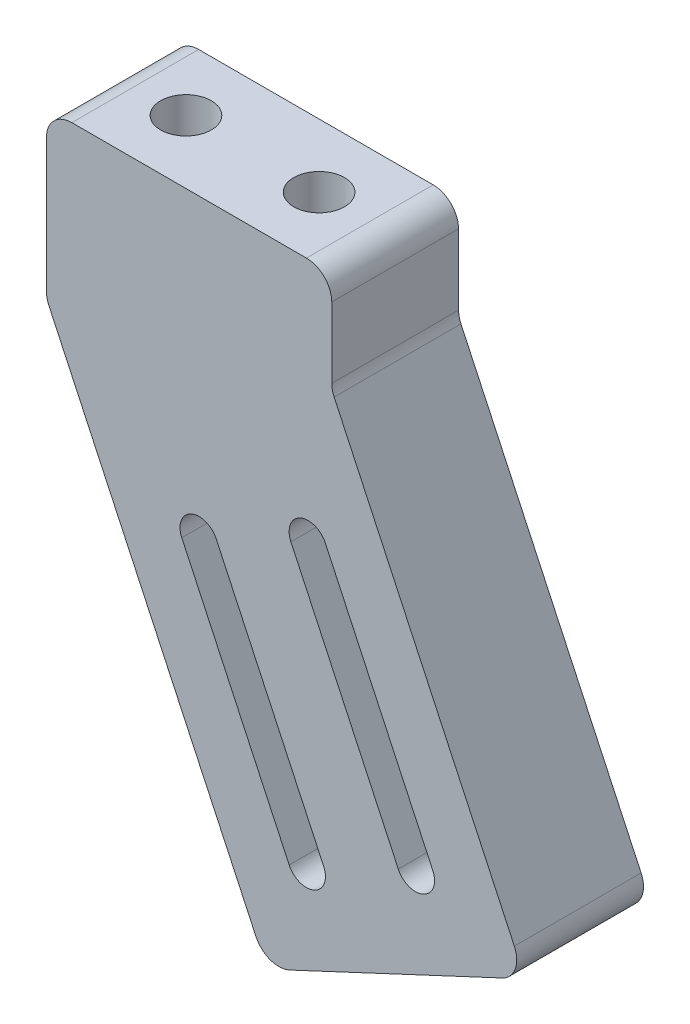
ISO-10303-21;
HEADER;
FILE_DESCRIPTION(('STEP AP214'),'2;1');
FILE_NAME('part.step','',(''),(''),'','','');
FILE_SCHEMA(('AUTOMOTIVE_DESIGN { 1 0 10303 214 1 1 1 1 }'));
ENDSEC;
DATA;
#1=APPLICATION_CONTEXT('core data for automotive mechanical design processes');
#2=APPLICATION_PROTOCOL_DEFINITION('international standard','automotive_design',2000,#1);
#3=PRODUCT_CONTEXT('',#1,'mechanical');
#4=PRODUCT('Part','Part','',(#3));
#5=PRODUCT_RELATED_PRODUCT_CATEGORY('part','',(#4));
#6=PRODUCT_DEFINITION_FORMATION('','',#4);
#7=PRODUCT_DEFINITION_CONTEXT('part definition',#1,'design');
#8=PRODUCT_DEFINITION('design','',#6,#7);
#9=PRODUCT_DEFINITION_SHAPE('','',#8);
#10=(LENGTH_UNIT() NAMED_UNIT(*) SI_UNIT(.MILLI.,.METRE.));
#11=(NAMED_UNIT(*) PLANE_ANGLE_UNIT() SI_UNIT($,.RADIAN.));
#12=(NAMED_UNIT(*) SI_UNIT($,.STERADIAN.) SOLID_ANGLE_UNIT());
#13=UNCERTAINTY_MEASURE_WITH_UNIT(LENGTH_MEASURE(1.E-05),#10,'distance_accuracy_value','');
#14=(GEOMETRIC_REPRESENTATION_CONTEXT(3) GLOBAL_UNCERTAINTY_ASSIGNED_CONTEXT((#13)) GLOBAL_UNIT_ASSIGNED_CONTEXT((#10,
#11,#12)) REPRESENTATION_CONTEXT('',''));
#15=CARTESIAN_POINT('',(0.,0.,0.));
#16=DIRECTION('',(0.,0.,1.));
#17=DIRECTION('',(1.,0.,0.));
#18=AXIS2_PLACEMENT_3D('',#15,#16,#17);
#19=CARTESIAN_POINT('',(0.,0.,0.));
#20=DIRECTION('',(0.,0.,-1.));
#21=DIRECTION('',(-1.,0.,0.));
#22=AXIS2_PLACEMENT_3D('',#19,#20,#21);
#23=PLANE('',#22);
#24=DIRECTION('',(0.,-1.,0.));
#25=VECTOR('',#24,1.);
#26=CARTESIAN_POINT('',(0.,-13.,0.));
#27=LINE('',#26,#25);
#28=CARTESIAN_POINT('',(0.,-2.,0.));
#29=VERTEX_POINT('',#28);
#30=CARTESIAN_POINT('',(0.,-12.5555555555556,0.));
#31=VERTEX_POINT('',#30);
#32=EDGE_CURVE('E366',#29,#31,#27,.T.);
#33=ORIENTED_EDGE('',*,*,#32,.F.);
#34=CARTESIAN_POINT('',(2.,-2.,0.));
#35=DIRECTION('',(0.,0.,-1.));
#36=DIRECTION('',(-1.,0.,0.));
#37=AXIS2_PLACEMENT_3D('',#34,#35,#36);
#38=CIRCLE('',#37,2.);
#39=CARTESIAN_POINT('',(2.,0.,0.));
#40=VERTEX_POINT('',#39);
#41=EDGE_CURVE('E418',#29,#40,#38,.T.);
#42=ORIENTED_EDGE('',*,*,#41,.T.);
#43=DIRECTION('',(-1.,0.,0.));
#44=VECTOR('',#43,1.);
#45=CARTESIAN_POINT('',(0.,0.,0.));
#46=LINE('',#45,#44);
#47=CARTESIAN_POINT('',(20.5,0.,0.));
#48=VERTEX_POINT('',#47);
#49=EDGE_CURVE('E371',#48,#40,#46,.T.);
#50=ORIENTED_EDGE('',*,*,#49,.F.);
#51=CARTESIAN_POINT('',(20.5,-2.,0.));
#52=DIRECTION('',(0.,0.,-1.));
#53=DIRECTION('',(-1.,0.,0.));
#54=AXIS2_PLACEMENT_3D('',#51,#52,#53);
#55=CIRCLE('',#54,2.);
#56=CARTESIAN_POINT('',(22.5,-2.,0.));
#57=VERTEX_POINT('',#56);
#58=EDGE_CURVE('E410',#48,#57,#55,.T.);
#59=ORIENTED_EDGE('',*,*,#58,.T.);
#60=DIRECTION('',(0.,1.,0.));
#61=VECTOR('',#60,1.);
#62=CARTESIAN_POINT('',(22.5,0.,0.));
#63=LINE('',#62,#61);
#64=CARTESIAN_POINT('',(22.5,-7.55555555555555,0.));
#65=VERTEX_POINT('',#64);
#66=EDGE_CURVE('E396',#65,#57,#63,.T.);
#67=ORIENTED_EDGE('',*,*,#66,.F.);
#68=CARTESIAN_POINT('',(24.5,-7.55555555555555,0.));
#69=DIRECTION('',(0.,0.,-1.));
#70=DIRECTION('',(-1.,0.,0.));
#71=AXIS2_PLACEMENT_3D('',#68,#69,#70);
#72=CIRCLE('',#71,2.);
#73=CARTESIAN_POINT('',(22.6882352941176,-8.40261437908496,0.));
#74=VERTEX_POINT('',#73);
#75=EDGE_CURVE('E42',#65,#74,#72,.F.);
#76=ORIENTED_EDGE('',*,*,#75,.T.);
#77=DIRECTION('',(-0.423529411764706,0.905882352941176,0.));
#78=VECTOR('',#77,1.);
#79=CARTESIAN_POINT('',(22.5,-8.,0.));
#80=LINE('',#79,#78);
#81=CARTESIAN_POINT('',(36.9,-38.8,0.));
#82=VERTEX_POINT('',#81);
#83=EDGE_CURVE('E393',#82,#74,#80,.T.);
#84=ORIENTED_EDGE('',*,*,#83,.F.);
#85=CARTESIAN_POINT('',(35.0882352941177,-39.6470588235294,0.));
#86=DIRECTION('',(0.,0.,-1.));
#87=DIRECTION('',(-1.,0.,0.));
#88=AXIS2_PLACEMENT_3D('',#85,#86,#87);
#89=CIRCLE('',#88,2.);
#90=CARTESIAN_POINT('',(35.9352941176471,-41.4588235294118,0.));
#91=VERTEX_POINT('',#90);
#92=EDGE_CURVE('E412',#82,#91,#89,.T.);
#93=ORIENTED_EDGE('',*,*,#92,.T.);
#94=DIRECTION('',(0.905882352941176,0.423529411764706,0.));
#95=VECTOR('',#94,1.);
#96=CARTESIAN_POINT('',(37.7470588235294,-40.6117647058824,0.));
#97=LINE('',#96,#95);
#98=CARTESIAN_POINT('',(19.1764705882353,-49.2941176470588,0.));
#99=VERTEX_POINT('',#98);
#100=EDGE_CURVE('E390',#99,#91,#97,.T.);
#101=ORIENTED_EDGE('',*,*,#100,.F.);
#102=CARTESIAN_POINT('',(18.3294117647059,-47.4823529411765,0.));
#103=DIRECTION('',(0.,0.,-1.));
#104=DIRECTION('',(-1.,0.,0.));
#105=AXIS2_PLACEMENT_3D('',#102,#103,#104);
#106=CIRCLE('',#105,2.);
#107=CARTESIAN_POINT('',(16.5176470588235,-48.3294117647059,0.));
#108=VERTEX_POINT('',#107);
#109=EDGE_CURVE('E414',#99,#108,#106,.T.);
#110=ORIENTED_EDGE('',*,*,#109,.T.);
#111=DIRECTION('',(0.423529411764706,-0.905882352941176,0.));
#112=VECTOR('',#111,1.);
#113=CARTESIAN_POINT('',(17.364705882353,-50.1411764705882,0.));
#114=LINE('',#113,#112);
#115=CARTESIAN_POINT('',(0.188235294117645,-13.402614379085,0.));
#116=VERTEX_POINT('',#115);
#117=EDGE_CURVE('E387',#116,#108,#114,.T.);
#118=ORIENTED_EDGE('',*,*,#117,.F.);
#119=CARTESIAN_POINT('',(2.,-12.5555555555556,0.));
#120=DIRECTION('',(0.,0.,-1.));
#121=DIRECTION('',(-1.,0.,0.));
#122=AXIS2_PLACEMENT_3D('',#119,#120,#121);
#123=CIRCLE('',#122,2.);
#124=EDGE_CURVE('E416',#116,#31,#123,.T.);
#125=ORIENTED_EDGE('',*,*,#124,.T.);
#126=EDGE_LOOP('',(#33,#42,#50,#59,#67,#76,#84,#93,#101,#110,#118,#125));
#127=FACE_BOUND('',#126,.T.);
#128=DIRECTION('',(-0.423529411764706,0.905882352941176,0.));
#129=VECTOR('',#128,1.);
#130=CARTESIAN_POINT('',(13.3882352941176,-22.7470588235294,0.));
#131=LINE('',#130,#129);
#132=CARTESIAN_POINT('',(21.8588235294118,-40.8647058823529,0.));
#133=VERTEX_POINT('',#132);
#134=CARTESIAN_POINT('',(13.3882352941176,-22.7470588235294,0.));
#135=VERTEX_POINT('',#134);
#136=EDGE_CURVE('E339',#133,#135,#131,.T.);
#137=ORIENTED_EDGE('',*,*,#136,.T.);
#138=CARTESIAN_POINT('',(12.0294117647059,-23.3823529411765,0.));
#139=DIRECTION('',(0.,0.,1.));
#140=DIRECTION('',(1.,0.,0.));
#141=AXIS2_PLACEMENT_3D('',#138,#139,#140);
#142=CIRCLE('',#141,1.5);
#143=CARTESIAN_POINT('',(10.6705882352941,-24.0176470588235,0.));
#144=VERTEX_POINT('',#143);
#145=EDGE_CURVE('E335',#135,#144,#142,.T.);
#146=ORIENTED_EDGE('',*,*,#145,.T.);
#147=DIRECTION('',(0.423529411764706,-0.905882352941176,0.));
#148=VECTOR('',#147,1.);
#149=CARTESIAN_POINT('',(10.6705882352941,-24.0176470588235,0.));
#150=LINE('',#149,#148);
#151=CARTESIAN_POINT('',(19.1411764705882,-42.135294117647,0.));
#152=VERTEX_POINT('',#151);
#153=EDGE_CURVE('E349',#144,#152,#150,.T.);
#154=ORIENTED_EDGE('',*,*,#153,.T.);
#155=CARTESIAN_POINT('',(20.5,-41.5,0.));
#156=DIRECTION('',(0.,0.,1.));
#157=DIRECTION('',(1.,0.,0.));
#158=AXIS2_PLACEMENT_3D('',#155,#156,#157);
#159=CIRCLE('',#158,1.5);
#160=EDGE_CURVE('E352',#152,#133,#159,.T.);
#161=ORIENTED_EDGE('',*,*,#160,.T.);
#162=EDGE_LOOP('',(#137,#146,#154,#161));
#163=FACE_BOUND('',#162,.T.);
#164=DIRECTION('',(-0.423529411764706,0.905882352941176,0.));
#165=VECTOR('',#164,1.);
#166=CARTESIAN_POINT('',(21.9941176470588,-18.7235294117647,0.));
#167=LINE('',#166,#165);
#168=CARTESIAN_POINT('',(30.464705882353,-36.8411764705882,0.));
#169=VERTEX_POINT('',#168);
#170=CARTESIAN_POINT('',(21.9941176470588,-18.7235294117647,0.));
#171=VERTEX_POINT('',#170);
#172=EDGE_CURVE('E308',#169,#171,#167,.T.);
#173=ORIENTED_EDGE('',*,*,#172,.T.);
#174=CARTESIAN_POINT('',(20.6352941176471,-19.3588235294118,0.));
#175=DIRECTION('',(0.,0.,1.));
#176=DIRECTION('',(1.,0.,0.));
#177=AXIS2_PLACEMENT_3D('',#174,#175,#176);
#178=CIRCLE('',#177,1.5);
#179=CARTESIAN_POINT('',(19.2764705882353,-19.9941176470588,0.));
#180=VERTEX_POINT('',#179);
#181=EDGE_CURVE('E304',#171,#180,#178,.T.);
#182=ORIENTED_EDGE('',*,*,#181,.T.);
#183=DIRECTION('',(0.423529411764706,-0.905882352941177,0.));
#184=VECTOR('',#183,1.);
#185=CARTESIAN_POINT('',(19.2764705882353,-19.9941176470588,0.));
#186=LINE('',#185,#184);
#187=CARTESIAN_POINT('',(27.7470588235294,-38.1117647058824,0.));
#188=VERTEX_POINT('',#187);
#189=EDGE_CURVE('E318',#180,#188,#186,.T.);
#190=ORIENTED_EDGE('',*,*,#189,.T.);
#191=CARTESIAN_POINT('',(29.1058823529412,-37.4764705882353,0.));
#192=DIRECTION('',(0.,0.,1.));
#193=DIRECTION('',(1.,0.,0.));
#194=AXIS2_PLACEMENT_3D('',#191,#192,#193);
#195=CIRCLE('',#194,1.50000000000001);
#196=EDGE_CURVE('E321',#188,#169,#195,.T.);
#197=ORIENTED_EDGE('',*,*,#196,.T.);
#198=EDGE_LOOP('',(#173,#182,#190,#197));
#199=FACE_BOUND('',#198,.T.);
#200=DIRECTION('',(1.,0.,0.));
#201=VECTOR('',#200,1.);
#202=CARTESIAN_POINT('',(2.25,-7.7,0.));
#203=LINE('',#202,#201);
#204=CARTESIAN_POINT('',(2.25,-7.7,0.));
#205=VERTEX_POINT('',#204);
#206=CARTESIAN_POINT('',(9.75,-7.7,0.));
#207=VERTEX_POINT('',#206);
#208=EDGE_CURVE('E263',#205,#207,#203,.T.);
#209=ORIENTED_EDGE('',*,*,#208,.T.);
#210=DIRECTION('',(0.,1.,0.));
#211=VECTOR('',#210,1.);
#212=CARTESIAN_POINT('',(9.75,-5.,0.));
#213=LINE('',#212,#211);
#214=CARTESIAN_POINT('',(9.75,-5.,0.));
#215=VERTEX_POINT('',#214);
#216=EDGE_CURVE('E270',#207,#215,#213,.T.);
#217=ORIENTED_EDGE('',*,*,#216,.T.);
#218=DIRECTION('',(-1.,0.,0.));
#219=VECTOR('',#218,1.);
#220=CARTESIAN_POINT('',(2.25,-5.,0.));
#221=LINE('',#220,#219);
#222=CARTESIAN_POINT('',(2.25,-5.,0.));
#223=VERTEX_POINT('',#222);
#224=EDGE_CURVE('E273',#215,#223,#221,.T.);
#225=ORIENTED_EDGE('',*,*,#224,.T.);
#226=DIRECTION('',(0.,-1.,0.));
#227=VECTOR('',#226,1.);
#228=CARTESIAN_POINT('',(2.25,-5.,0.));
#229=LINE('',#228,#227);
#230=EDGE_CURVE('E276',#223,#205,#229,.T.);
#231=ORIENTED_EDGE('',*,*,#230,.T.);
#232=EDGE_LOOP('',(#209,#217,#225,#231));
#233=FACE_BOUND('',#232,.T.);
#234=DIRECTION('',(1.,0.,0.));
#235=VECTOR('',#234,1.);
#236=CARTESIAN_POINT('',(12.75,-7.7,0.));
#237=LINE('',#236,#235);
#238=CARTESIAN_POINT('',(12.75,-7.7,0.));
#239=VERTEX_POINT('',#238);
#240=CARTESIAN_POINT('',(20.25,-7.7,0.));
#241=VERTEX_POINT('',#240);
#242=EDGE_CURVE('E243',#239,#241,#237,.T.);
#243=ORIENTED_EDGE('',*,*,#242,.T.);
#244=DIRECTION('',(0.,1.,0.));
#245=VECTOR('',#244,1.);
#246=CARTESIAN_POINT('',(20.25,-5.,0.));
#247=LINE('',#246,#245);
#248=CARTESIAN_POINT('',(20.25,-5.,0.));
#249=VERTEX_POINT('',#248);
#250=EDGE_CURVE('E875',#241,#249,#247,.T.);
#251=ORIENTED_EDGE('',*,*,#250,.T.);
#252=DIRECTION('',(-1.,0.,0.));
#253=VECTOR('',#252,1.);
#254=CARTESIAN_POINT('',(12.75,-5.,0.));
#255=LINE('',#254,#253);
#256=CARTESIAN_POINT('',(12.75,-5.,0.));
#257=VERTEX_POINT('',#256);
#258=EDGE_CURVE('E248',#249,#257,#255,.T.);
#259=ORIENTED_EDGE('',*,*,#258,.T.);
#260=DIRECTION('',(0.,-1.,0.));
#261=VECTOR('',#260,1.);
#262=CARTESIAN_POINT('',(12.75,-5.,0.));
#263=LINE('',#262,#261);
#264=EDGE_CURVE('E877',#257,#239,#263,.T.);
#265=ORIENTED_EDGE('',*,*,#264,.T.);
#266=EDGE_LOOP('',(#243,#251,#259,#265));
#267=FACE_BOUND('',#266,.T.);
#268=ADVANCED_FACE('F34',(#127,#163,#199,#233,#267),#23,.T.);
#269=CARTESIAN_POINT('',(16.5,0.,5.));
#270=DIRECTION('',(0.,1.,0.));
#271=DIRECTION('',(0.,0.,1.));
#272=AXIS2_PLACEMENT_3D('',#269,#270,#271);
#273=CYLINDRICAL_SURFACE('',#272,1.99999999999999);
#274=CARTESIAN_POINT('',(16.5,0.,5.));
#275=DIRECTION('',(0.,1.,0.));
#276=DIRECTION('',(0.,0.,1.));
#277=AXIS2_PLACEMENT_3D('',#274,#275,#276);
#278=CIRCLE('',#277,1.99999999999999);
#279=CARTESIAN_POINT('',(16.5,0.,6.99999999999999));
#280=VERTEX_POINT('',#279);
#281=EDGE_CURVE('E298',#280,#280,#278,.T.);
#282=ORIENTED_EDGE('',*,*,#281,.T.);
#283=EDGE_LOOP('',(#282));
#284=FACE_BOUND('',#283,.T.);
#285=CARTESIAN_POINT('',(16.5,-5.,5.));
#286=DIRECTION('',(0.,-1.,0.));
#287=DIRECTION('',(0.,0.,-1.));
#288=AXIS2_PLACEMENT_3D('',#285,#286,#287);
#289=CIRCLE('',#288,1.99999999999999);
#290=CARTESIAN_POINT('',(16.5,-5.,3.00000000000001));
#291=VERTEX_POINT('',#290);
#292=EDGE_CURVE('E253',#291,#291,#289,.F.);
#293=ORIENTED_EDGE('',*,*,#292,.F.);
#294=EDGE_LOOP('',(#293));
#295=FACE_BOUND('',#294,.T.);
#296=ADVANCED_FACE('F514',(#284,#295),#273,.F.);
#297=CARTESIAN_POINT('',(6.,0.,5.));
#298=DIRECTION('',(0.,1.,0.));
#299=DIRECTION('',(0.,0.,1.));
#300=AXIS2_PLACEMENT_3D('',#297,#298,#299);
#301=CYLINDRICAL_SURFACE('',#300,1.99999999999999);
#302=CARTESIAN_POINT('',(6.,0.,5.));
#303=DIRECTION('',(0.,1.,0.));
#304=DIRECTION('',(0.,0.,1.));
#305=AXIS2_PLACEMENT_3D('',#302,#303,#304);
#306=CIRCLE('',#305,1.99999999999999);
#307=CARTESIAN_POINT('',(6.,0.,6.99999999999999));
#308=VERTEX_POINT('',#307);
#309=EDGE_CURVE('E291',#308,#308,#306,.T.);
#310=ORIENTED_EDGE('',*,*,#309,.T.);
#311=EDGE_LOOP('',(#310));
#312=FACE_BOUND('',#311,.T.);
#313=CARTESIAN_POINT('',(6.,-5.,5.));
#314=DIRECTION('',(0.,-1.,0.));
#315=DIRECTION('',(0.,0.,-1.));
#316=AXIS2_PLACEMENT_3D('',#313,#314,#315);
#317=CIRCLE('',#316,1.99999999999999);
#318=CARTESIAN_POINT('',(6.,-5.,3.00000000000001));
#319=VERTEX_POINT('',#318);
#320=EDGE_CURVE('E295',#319,#319,#317,.F.);
#321=ORIENTED_EDGE('',*,*,#320,.F.);
#322=EDGE_LOOP('',(#321));
#323=FACE_BOUND('',#322,.T.);
#324=ADVANCED_FACE('F521',(#312,#323),#301,.F.);
#325=CARTESIAN_POINT('',(0.,0.,10.));
#326=DIRECTION('',(0.,0.,-1.));
#327=DIRECTION('',(-1.,0.,0.));
#328=AXIS2_PLACEMENT_3D('',#325,#326,#327);
#329=PLANE('',#328);
#330=CARTESIAN_POINT('',(12.0294117647059,-23.3823529411765,10.));
#331=DIRECTION('',(0.,0.,1.));
#332=DIRECTION('',(1.,0.,0.));
#333=AXIS2_PLACEMENT_3D('',#330,#331,#332);
#334=CIRCLE('',#333,1.5);
#335=CARTESIAN_POINT('',(13.3882352941176,-22.7470588235294,10.));
#336=VERTEX_POINT('',#335);
#337=CARTESIAN_POINT('',(10.6705882352941,-24.0176470588235,10.));
#338=VERTEX_POINT('',#337);
#339=EDGE_CURVE('E336',#336,#338,#334,.T.);
#340=ORIENTED_EDGE('',*,*,#339,.F.);
#341=DIRECTION('',(-0.423529411764706,0.905882352941176,0.));
#342=VECTOR('',#341,1.);
#343=CARTESIAN_POINT('',(13.3882352941176,-22.7470588235294,10.));
#344=LINE('',#343,#342);
#345=CARTESIAN_POINT('',(21.8588235294118,-40.8647058823529,10.));
#346=VERTEX_POINT('',#345);
#347=EDGE_CURVE('E344',#346,#336,#344,.T.);
#348=ORIENTED_EDGE('',*,*,#347,.F.);
#349=CARTESIAN_POINT('',(20.5,-41.5,10.));
#350=DIRECTION('',(0.,0.,1.));
#351=DIRECTION('',(1.,0.,0.));
#352=AXIS2_PLACEMENT_3D('',#349,#350,#351);
#353=CIRCLE('',#352,1.5);
#354=CARTESIAN_POINT('',(19.1411764705882,-42.135294117647,10.));
#355=VERTEX_POINT('',#354);
#356=EDGE_CURVE('E341',#355,#346,#353,.T.);
#357=ORIENTED_EDGE('',*,*,#356,.F.);
#358=DIRECTION('',(0.423529411764706,-0.905882352941176,0.));
#359=VECTOR('',#358,1.);
#360=CARTESIAN_POINT('',(10.6705882352941,-24.0176470588235,10.));
#361=LINE('',#360,#359);
#362=EDGE_CURVE('E338',#338,#355,#361,.T.);
#363=ORIENTED_EDGE('',*,*,#362,.F.);
#364=EDGE_LOOP('',(#340,#348,#357,#363));
#365=FACE_BOUND('',#364,.T.);
#366=DIRECTION('',(-1.,0.,0.));
#367=VECTOR('',#366,1.);
#368=CARTESIAN_POINT('',(0.,0.,10.));
#369=LINE('',#368,#367);
#370=CARTESIAN_POINT('',(20.5,0.,10.));
#371=VERTEX_POINT('',#370);
#372=CARTESIAN_POINT('',(2.,0.,10.));
#373=VERTEX_POINT('',#372);
#374=EDGE_CURVE('E381',#371,#373,#369,.T.);
#375=ORIENTED_EDGE('',*,*,#374,.T.);
#376=CARTESIAN_POINT('',(2.,-2.,10.));
#377=DIRECTION('',(0.,0.,-1.));
#378=DIRECTION('',(-1.,0.,0.));
#379=AXIS2_PLACEMENT_3D('',#376,#377,#378);
#380=CIRCLE('',#379,2.);
#381=CARTESIAN_POINT('',(0.,-2.,10.));
#382=VERTEX_POINT('',#381);
#383=EDGE_CURVE('E433',#373,#382,#380,.F.);
#384=ORIENTED_EDGE('',*,*,#383,.T.);
#385=DIRECTION('',(0.,-1.,0.));
#386=VECTOR('',#385,1.);
#387=CARTESIAN_POINT('',(0.,-13.,10.));
#388=LINE('',#387,#386);
#389=CARTESIAN_POINT('',(0.,-12.5555555555556,10.));
#390=VERTEX_POINT('',#389);
#391=EDGE_CURVE('E367',#382,#390,#388,.T.);
#392=ORIENTED_EDGE('',*,*,#391,.T.);
#393=CARTESIAN_POINT('',(2.,-12.5555555555556,10.));
#394=DIRECTION('',(0.,0.,-1.));
#395=DIRECTION('',(-1.,0.,0.));
#396=AXIS2_PLACEMENT_3D('',#393,#394,#395);
#397=CIRCLE('',#396,2.);
#398=CARTESIAN_POINT('',(0.188235294117645,-13.402614379085,10.));
#399=VERTEX_POINT('',#398);
#400=EDGE_CURVE('E431',#390,#399,#397,.F.);
#401=ORIENTED_EDGE('',*,*,#400,.T.);
#402=DIRECTION('',(0.423529411764706,-0.905882352941176,0.));
#403=VECTOR('',#402,1.);
#404=CARTESIAN_POINT('',(17.364705882353,-50.1411764705882,10.));
#405=LINE('',#404,#403);
#406=CARTESIAN_POINT('',(16.5176470588235,-48.3294117647059,10.));
#407=VERTEX_POINT('',#406);
#408=EDGE_CURVE('E370',#399,#407,#405,.T.);
#409=ORIENTED_EDGE('',*,*,#408,.T.);
#410=CARTESIAN_POINT('',(18.3294117647059,-47.4823529411765,10.));
#411=DIRECTION('',(0.,0.,-1.));
#412=DIRECTION('',(-1.,0.,0.));
#413=AXIS2_PLACEMENT_3D('',#410,#411,#412);
#414=CIRCLE('',#413,2.);
#415=CARTESIAN_POINT('',(19.1764705882353,-49.2941176470588,10.));
#416=VERTEX_POINT('',#415);
#417=EDGE_CURVE('E429',#407,#416,#414,.F.);
#418=ORIENTED_EDGE('',*,*,#417,.T.);
#419=DIRECTION('',(0.905882352941176,0.423529411764706,0.));
#420=VECTOR('',#419,1.);
#421=CARTESIAN_POINT('',(37.7470588235294,-40.6117647058824,10.));
#422=LINE('',#421,#420);
#423=CARTESIAN_POINT('',(35.9352941176471,-41.4588235294118,10.));
#424=VERTEX_POINT('',#423);
#425=EDGE_CURVE('E374',#416,#424,#422,.T.);
#426=ORIENTED_EDGE('',*,*,#425,.T.);
#427=CARTESIAN_POINT('',(35.0882352941177,-39.6470588235294,10.));
#428=DIRECTION('',(0.,0.,-1.));
#429=DIRECTION('',(-1.,0.,0.));
#430=AXIS2_PLACEMENT_3D('',#427,#428,#429);
#431=CIRCLE('',#430,2.);
#432=CARTESIAN_POINT('',(36.9,-38.8,10.));
#433=VERTEX_POINT('',#432);
#434=EDGE_CURVE('E427',#424,#433,#431,.F.);
#435=ORIENTED_EDGE('',*,*,#434,.T.);
#436=DIRECTION('',(-0.423529411764706,0.905882352941176,0.));
#437=VECTOR('',#436,1.);
#438=CARTESIAN_POINT('',(22.5,-8.,10.));
#439=LINE('',#438,#437);
#440=CARTESIAN_POINT('',(22.6882352941176,-8.40261437908496,10.));
#441=VERTEX_POINT('',#440);
#442=EDGE_CURVE('E377',#433,#441,#439,.T.);
#443=ORIENTED_EDGE('',*,*,#442,.T.);
#444=CARTESIAN_POINT('',(24.5,-7.55555555555555,10.));
#445=DIRECTION('',(0.,0.,-1.));
#446=DIRECTION('',(-1.,0.,0.));
#447=AXIS2_PLACEMENT_3D('',#444,#445,#446);
#448=CIRCLE('',#447,2.);
#449=CARTESIAN_POINT('',(22.5,-7.55555555555555,10.));
#450=VERTEX_POINT('',#449);
#451=EDGE_CURVE('E11',#441,#450,#448,.T.);
#452=ORIENTED_EDGE('',*,*,#451,.T.);
#453=DIRECTION('',(0.,1.,0.));
#454=VECTOR('',#453,1.);
#455=CARTESIAN_POINT('',(22.5,0.,10.));
#456=LINE('',#455,#454);
#457=CARTESIAN_POINT('',(22.5,-2.,10.));
#458=VERTEX_POINT('',#457);
#459=EDGE_CURVE('E379',#450,#458,#456,.T.);
#460=ORIENTED_EDGE('',*,*,#459,.T.);
#461=CARTESIAN_POINT('',(20.5,-2.,10.));
#462=DIRECTION('',(0.,0.,-1.));
#463=DIRECTION('',(-1.,0.,0.));
#464=AXIS2_PLACEMENT_3D('',#461,#462,#463);
#465=CIRCLE('',#464,2.);
#466=EDGE_CURVE('E425',#458,#371,#465,.F.);
#467=ORIENTED_EDGE('',*,*,#466,.T.);
#468=EDGE_LOOP('',(#375,#384,#392,#401,#409,#418,#426,#435,#443,#452,#460,#467));
#469=FACE_BOUND('',#468,.T.);
#470=CARTESIAN_POINT('',(20.6352941176471,-19.3588235294118,10.));
#471=DIRECTION('',(0.,0.,1.));
#472=DIRECTION('',(1.,0.,0.));
#473=AXIS2_PLACEMENT_3D('',#470,#471,#472);
#474=CIRCLE('',#473,1.5);
#475=CARTESIAN_POINT('',(21.9941176470588,-18.7235294117647,10.));
#476=VERTEX_POINT('',#475);
#477=CARTESIAN_POINT('',(19.2764705882353,-19.9941176470588,10.));
#478=VERTEX_POINT('',#477);
#479=EDGE_CURVE('E305',#476,#478,#474,.T.);
#480=ORIENTED_EDGE('',*,*,#479,.F.);
#481=DIRECTION('',(-0.423529411764706,0.905882352941176,0.));
#482=VECTOR('',#481,1.);
#483=CARTESIAN_POINT('',(21.9941176470588,-18.7235294117647,10.));
#484=LINE('',#483,#482);
#485=CARTESIAN_POINT('',(30.464705882353,-36.8411764705882,10.));
#486=VERTEX_POINT('',#485);
#487=EDGE_CURVE('E313',#486,#476,#484,.T.);
#488=ORIENTED_EDGE('',*,*,#487,.F.);
#489=CARTESIAN_POINT('',(29.1058823529412,-37.4764705882353,10.));
#490=DIRECTION('',(0.,0.,1.));
#491=DIRECTION('',(1.,0.,0.));
#492=AXIS2_PLACEMENT_3D('',#489,#490,#491);
#493=CIRCLE('',#492,1.50000000000001);
#494=CARTESIAN_POINT('',(27.7470588235294,-38.1117647058824,10.));
#495=VERTEX_POINT('',#494);
#496=EDGE_CURVE('E310',#495,#486,#493,.T.);
#497=ORIENTED_EDGE('',*,*,#496,.F.);
#498=DIRECTION('',(0.423529411764706,-0.905882352941177,0.));
#499=VECTOR('',#498,1.);
#500=CARTESIAN_POINT('',(19.2764705882353,-19.9941176470588,10.));
#501=LINE('',#500,#499);
#502=EDGE_CURVE('E307',#478,#495,#501,.T.);
#503=ORIENTED_EDGE('',*,*,#502,.F.);
#504=EDGE_LOOP('',(#480,#488,#497,#503));
#505=FACE_BOUND('',#504,.T.);
#506=ADVANCED_FACE('F468',(#365,#469,#505),#329,.F.);
#507=CARTESIAN_POINT('',(0.,-13.,10.));
#508=DIRECTION('',(1.,0.,0.));
#509=DIRECTION('',(0.,1.,0.));
#510=AXIS2_PLACEMENT_3D('',#507,#508,#509);
#511=PLANE('',#510);
#512=ORIENTED_EDGE('',*,*,#391,.F.);
#513=DIRECTION('',(0.,0.,-1.));
#514=VECTOR('',#513,1.);
#515=CARTESIAN_POINT('',(0.,-2.,10.));
#516=LINE('',#515,#514);
#517=EDGE_CURVE('E407',#382,#29,#516,.T.);
#518=ORIENTED_EDGE('',*,*,#517,.T.);
#519=ORIENTED_EDGE('',*,*,#32,.T.);
#520=DIRECTION('',(0.,0.,-1.));
#521=VECTOR('',#520,1.);
#522=CARTESIAN_POINT('',(0.,-12.5555555555556,10.));
#523=LINE('',#522,#521);
#524=EDGE_CURVE('E384',#31,#390,#523,.F.);
#525=ORIENTED_EDGE('',*,*,#524,.T.);
#526=EDGE_LOOP('',(#512,#518,#519,#525));
#527=FACE_BOUND('',#526,.T.);
#528=ADVANCED_FACE('F483',(#527),#511,.F.);
#529=CARTESIAN_POINT('',(17.364705882353,-50.1411764705882,10.));
#530=DIRECTION('',(0.905882352941176,0.423529411764706,0.));
#531=DIRECTION('',(-0.423529411764706,0.905882352941176,0.));
#532=AXIS2_PLACEMENT_3D('',#529,#530,#531);
#533=PLANE('',#532);
#534=ORIENTED_EDGE('',*,*,#408,.F.);
#535=DIRECTION('',(0.,0.,-1.));
#536=VECTOR('',#535,1.);
#537=CARTESIAN_POINT('',(0.188235294117649,-13.402614379085,10.));
#538=LINE('',#537,#536);
#539=EDGE_CURVE('E437',#399,#116,#538,.T.);
#540=ORIENTED_EDGE('',*,*,#539,.T.);
#541=ORIENTED_EDGE('',*,*,#117,.T.);
#542=DIRECTION('',(0.,0.,-1.));
#543=VECTOR('',#542,1.);
#544=CARTESIAN_POINT('',(16.5176470588235,-48.3294117647059,10.));
#545=LINE('',#544,#543);
#546=EDGE_CURVE('E435',#108,#407,#545,.F.);
#547=ORIENTED_EDGE('',*,*,#546,.T.);
#548=EDGE_LOOP('',(#534,#540,#541,#547));
#549=FACE_BOUND('',#548,.T.);
#550=ADVANCED_FACE('F492',(#549),#533,.F.);
#551=CARTESIAN_POINT('',(37.7470588235294,-40.6117647058824,10.));
#552=DIRECTION('',(-0.423529411764706,0.905882352941176,0.));
#553=DIRECTION('',(-0.905882352941176,-0.423529411764706,0.));
#554=AXIS2_PLACEMENT_3D('',#551,#552,#553);
#555=PLANE('',#554);
#556=ORIENTED_EDGE('',*,*,#425,.F.);
#557=DIRECTION('',(0.,0.,-1.));
#558=VECTOR('',#557,1.);
#559=CARTESIAN_POINT('',(19.1764705882353,-49.2941176470588,10.));
#560=LINE('',#559,#558);
#561=EDGE_CURVE('E442',#416,#99,#560,.T.);
#562=ORIENTED_EDGE('',*,*,#561,.T.);
#563=ORIENTED_EDGE('',*,*,#100,.T.);
#564=DIRECTION('',(0.,0.,-1.));
#565=VECTOR('',#564,1.);
#566=CARTESIAN_POINT('',(35.9352941176471,-41.4588235294118,10.));
#567=LINE('',#566,#565);
#568=EDGE_CURVE('E440',#91,#424,#567,.F.);
#569=ORIENTED_EDGE('',*,*,#568,.T.);
#570=EDGE_LOOP('',(#556,#562,#563,#569));
#571=FACE_BOUND('',#570,.T.);
#572=ADVANCED_FACE('F501',(#571),#555,.F.);
#573=CARTESIAN_POINT('',(22.5,-8.,10.));
#574=DIRECTION('',(-0.905882352941176,-0.423529411764706,0.));
#575=DIRECTION('',(0.423529411764706,-0.905882352941176,0.));
#576=AXIS2_PLACEMENT_3D('',#573,#574,#575);
#577=PLANE('',#576);
#578=ORIENTED_EDGE('',*,*,#442,.F.);
#579=DIRECTION('',(0.,0.,-1.));
#580=VECTOR('',#579,1.);
#581=CARTESIAN_POINT('',(36.9,-38.8,10.));
#582=LINE('',#581,#580);
#583=EDGE_CURVE('E447',#433,#82,#582,.T.);
#584=ORIENTED_EDGE('',*,*,#583,.T.);
#585=ORIENTED_EDGE('',*,*,#83,.T.);
#586=DIRECTION('',(0.,0.,-1.));
#587=VECTOR('',#586,1.);
#588=CARTESIAN_POINT('',(22.6882352941176,-8.40261437908496,10.));
#589=LINE('',#588,#587);
#590=EDGE_CURVE('E445',#74,#441,#589,.F.);
#591=ORIENTED_EDGE('',*,*,#590,.T.);
#592=EDGE_LOOP('',(#578,#584,#585,#591));
#593=FACE_BOUND('',#592,.T.);
#594=ADVANCED_FACE('F463',(#593),#577,.F.);
#595=CARTESIAN_POINT('',(22.5,0.,10.));
#596=DIRECTION('',(-1.,0.,0.));
#597=DIRECTION('',(0.,0.,1.));
#598=AXIS2_PLACEMENT_3D('',#595,#596,#597);
#599=PLANE('',#598);
#600=ORIENTED_EDGE('',*,*,#459,.F.);
#601=DIRECTION('',(0.,0.,-1.));
#602=VECTOR('',#601,1.);
#603=CARTESIAN_POINT('',(22.5,-7.55555555555555,0.));
#604=LINE('',#603,#602);
#605=EDGE_CURVE('E451',#450,#65,#604,.T.);
#606=ORIENTED_EDGE('',*,*,#605,.T.);
#607=ORIENTED_EDGE('',*,*,#66,.T.);
#608=DIRECTION('',(0.,0.,-1.));
#609=VECTOR('',#608,1.);
#610=CARTESIAN_POINT('',(22.5,-2.,10.));
#611=LINE('',#610,#609);
#612=EDGE_CURVE('E49',#57,#458,#611,.F.);
#613=ORIENTED_EDGE('',*,*,#612,.T.);
#614=EDGE_LOOP('',(#600,#606,#607,#613));
#615=FACE_BOUND('',#614,.T.);
#616=ADVANCED_FACE('F466',(#615),#599,.F.);
#617=CARTESIAN_POINT('',(0.,0.,10.));
#618=DIRECTION('',(0.,-1.,0.));
#619=DIRECTION('',(1.,0.,0.));
#620=AXIS2_PLACEMENT_3D('',#617,#618,#619);
#621=PLANE('',#620);
#622=ORIENTED_EDGE('',*,*,#309,.F.);
#623=EDGE_LOOP('',(#622));
#624=FACE_BOUND('',#623,.T.);
#625=ORIENTED_EDGE('',*,*,#281,.F.);
#626=EDGE_LOOP('',(#625));
#627=FACE_BOUND('',#626,.T.);
#628=ORIENTED_EDGE('',*,*,#49,.T.);
#629=DIRECTION('',(0.,0.,-1.));
#630=VECTOR('',#629,1.);
#631=CARTESIAN_POINT('',(2.,0.,10.));
#632=LINE('',#631,#630);
#633=EDGE_CURVE('E423',#40,#373,#632,.F.);
#634=ORIENTED_EDGE('',*,*,#633,.T.);
#635=ORIENTED_EDGE('',*,*,#374,.F.);
#636=DIRECTION('',(0.,0.,-1.));
#637=VECTOR('',#636,1.);
#638=CARTESIAN_POINT('',(20.5,0.,10.));
#639=LINE('',#638,#637);
#640=EDGE_CURVE('E420',#371,#48,#639,.T.);
#641=ORIENTED_EDGE('',*,*,#640,.T.);
#642=EDGE_LOOP('',(#628,#634,#635,#641));
#643=FACE_BOUND('',#642,.T.);
#644=ADVANCED_FACE('F475',(#624,#627,#643),#621,.F.);
#645=CARTESIAN_POINT('',(12.0294117647059,-23.3823529411765,10.));
#646=DIRECTION('',(0.,0.,-1.));
#647=DIRECTION('',(-1.,0.,0.));
#648=AXIS2_PLACEMENT_3D('',#645,#646,#647);
#649=CYLINDRICAL_SURFACE('',#648,1.5);
#650=ORIENTED_EDGE('',*,*,#145,.F.);
#651=DIRECTION('',(0.,0.,-1.));
#652=VECTOR('',#651,1.);
#653=CARTESIAN_POINT('',(13.3882352941176,-22.7470588235294,10.));
#654=LINE('',#653,#652);
#655=EDGE_CURVE('E346',#336,#135,#654,.T.);
#656=ORIENTED_EDGE('',*,*,#655,.F.);
#657=ORIENTED_EDGE('',*,*,#339,.T.);
#658=DIRECTION('',(0.,0.,-1.));
#659=VECTOR('',#658,1.);
#660=CARTESIAN_POINT('',(10.6705882352941,-24.0176470588235,10.));
#661=LINE('',#660,#659);
#662=EDGE_CURVE('E363',#338,#144,#661,.T.);
#663=ORIENTED_EDGE('',*,*,#662,.T.);
#664=EDGE_LOOP('',(#650,#656,#657,#663));
#665=FACE_BOUND('',#664,.T.);
#666=ADVANCED_FACE('F530',(#665),#649,.F.);
#667=CARTESIAN_POINT('',(10.6705882352941,-24.0176470588235,10.));
#668=DIRECTION('',(0.905882352941176,0.423529411764706,0.));
#669=DIRECTION('',(-0.423529411764706,0.905882352941176,0.));
#670=AXIS2_PLACEMENT_3D('',#667,#668,#669);
#671=PLANE('',#670);
#672=ORIENTED_EDGE('',*,*,#153,.F.);
#673=ORIENTED_EDGE('',*,*,#662,.F.);
#674=ORIENTED_EDGE('',*,*,#362,.T.);
#675=DIRECTION('',(0.,0.,-1.));
#676=VECTOR('',#675,1.);
#677=CARTESIAN_POINT('',(19.1411764705882,-42.135294117647,10.));
#678=LINE('',#677,#676);
#679=EDGE_CURVE('E361',#355,#152,#678,.T.);
#680=ORIENTED_EDGE('',*,*,#679,.T.);
#681=EDGE_LOOP('',(#672,#673,#674,#680));
#682=FACE_BOUND('',#681,.T.);
#683=ADVANCED_FACE('F769',(#682),#671,.T.);
#684=CARTESIAN_POINT('',(20.5,-41.5,10.));
#685=DIRECTION('',(0.,0.,-1.));
#686=DIRECTION('',(-1.,0.,0.));
#687=AXIS2_PLACEMENT_3D('',#684,#685,#686);
#688=CYLINDRICAL_SURFACE('',#687,1.5);
#689=ORIENTED_EDGE('',*,*,#160,.F.);
#690=ORIENTED_EDGE('',*,*,#679,.F.);
#691=ORIENTED_EDGE('',*,*,#356,.T.);
#692=DIRECTION('',(0.,0.,-1.));
#693=VECTOR('',#692,1.);
#694=CARTESIAN_POINT('',(21.8588235294118,-40.8647058823529,10.));
#695=LINE('',#694,#693);
#696=EDGE_CURVE('E359',#346,#133,#695,.T.);
#697=ORIENTED_EDGE('',*,*,#696,.T.);
#698=EDGE_LOOP('',(#689,#690,#691,#697));
#699=FACE_BOUND('',#698,.T.);
#700=ADVANCED_FACE('F760',(#699),#688,.F.);
#701=CARTESIAN_POINT('',(13.3882352941176,-22.7470588235294,10.));
#702=DIRECTION('',(-0.905882352941176,-0.423529411764706,0.));
#703=DIRECTION('',(0.423529411764706,-0.905882352941176,0.));
#704=AXIS2_PLACEMENT_3D('',#701,#702,#703);
#705=PLANE('',#704);
#706=ORIENTED_EDGE('',*,*,#136,.F.);
#707=ORIENTED_EDGE('',*,*,#696,.F.);
#708=ORIENTED_EDGE('',*,*,#347,.T.);
#709=ORIENTED_EDGE('',*,*,#655,.T.);
#710=EDGE_LOOP('',(#706,#707,#708,#709));
#711=FACE_BOUND('',#710,.T.);
#712=ADVANCED_FACE('F751',(#711),#705,.T.);
#713=CARTESIAN_POINT('',(20.6352941176471,-19.3588235294118,10.));
#714=DIRECTION('',(0.,0.,-1.));
#715=DIRECTION('',(-1.,0.,0.));
#716=AXIS2_PLACEMENT_3D('',#713,#714,#715);
#717=CYLINDRICAL_SURFACE('',#716,1.5);
#718=ORIENTED_EDGE('',*,*,#181,.F.);
#719=DIRECTION('',(0.,0.,-1.));
#720=VECTOR('',#719,1.);
#721=CARTESIAN_POINT('',(21.9941176470588,-18.7235294117647,10.));
#722=LINE('',#721,#720);
#723=EDGE_CURVE('E315',#476,#171,#722,.T.);
#724=ORIENTED_EDGE('',*,*,#723,.F.);
#725=ORIENTED_EDGE('',*,*,#479,.T.);
#726=DIRECTION('',(0.,0.,-1.));
#727=VECTOR('',#726,1.);
#728=CARTESIAN_POINT('',(19.2764705882353,-19.9941176470588,10.));
#729=LINE('',#728,#727);
#730=EDGE_CURVE('E332',#478,#180,#729,.T.);
#731=ORIENTED_EDGE('',*,*,#730,.T.);
#732=EDGE_LOOP('',(#718,#724,#725,#731));
#733=FACE_BOUND('',#732,.T.);
#734=ADVANCED_FACE('F742',(#733),#717,.F.);
#735=CARTESIAN_POINT('',(19.2764705882353,-19.9941176470588,10.));
#736=DIRECTION('',(0.905882352941177,0.423529411764706,0.));
#737=DIRECTION('',(-0.423529411764706,0.905882352941177,0.));
#738=AXIS2_PLACEMENT_3D('',#735,#736,#737);
#739=PLANE('',#738);
#740=ORIENTED_EDGE('',*,*,#189,.F.);
#741=ORIENTED_EDGE('',*,*,#730,.F.);
#742=ORIENTED_EDGE('',*,*,#502,.T.);
#743=DIRECTION('',(0.,0.,-1.));
#744=VECTOR('',#743,1.);
#745=CARTESIAN_POINT('',(27.7470588235294,-38.1117647058824,10.));
#746=LINE('',#745,#744);
#747=EDGE_CURVE('E330',#495,#188,#746,.T.);
#748=ORIENTED_EDGE('',*,*,#747,.T.);
#749=EDGE_LOOP('',(#740,#741,#742,#748));
#750=FACE_BOUND('',#749,.T.);
#751=ADVANCED_FACE('F733',(#750),#739,.T.);
#752=CARTESIAN_POINT('',(29.1058823529412,-37.4764705882353,10.));
#753=DIRECTION('',(0.,0.,-1.));
#754=DIRECTION('',(-1.,0.,0.));
#755=AXIS2_PLACEMENT_3D('',#752,#753,#754);
#756=CYLINDRICAL_SURFACE('',#755,1.50000000000001);
#757=ORIENTED_EDGE('',*,*,#196,.F.);
#758=ORIENTED_EDGE('',*,*,#747,.F.);
#759=ORIENTED_EDGE('',*,*,#496,.T.);
#760=DIRECTION('',(0.,0.,-1.));
#761=VECTOR('',#760,1.);
#762=CARTESIAN_POINT('',(30.464705882353,-36.8411764705882,10.));
#763=LINE('',#762,#761);
#764=EDGE_CURVE('E328',#486,#169,#763,.T.);
#765=ORIENTED_EDGE('',*,*,#764,.T.);
#766=EDGE_LOOP('',(#757,#758,#759,#765));
#767=FACE_BOUND('',#766,.T.);
#768=ADVANCED_FACE('F724',(#767),#756,.F.);
#769=CARTESIAN_POINT('',(21.9941176470588,-18.7235294117647,10.));
#770=DIRECTION('',(-0.905882352941176,-0.423529411764706,0.));
#771=DIRECTION('',(0.423529411764706,-0.905882352941176,0.));
#772=AXIS2_PLACEMENT_3D('',#769,#770,#771);
#773=PLANE('',#772);
#774=ORIENTED_EDGE('',*,*,#172,.F.);
#775=ORIENTED_EDGE('',*,*,#764,.F.);
#776=ORIENTED_EDGE('',*,*,#487,.T.);
#777=ORIENTED_EDGE('',*,*,#723,.T.);
#778=EDGE_LOOP('',(#774,#775,#776,#777));
#779=FACE_BOUND('',#778,.T.);
#780=ADVANCED_FACE('F667',(#779),#773,.T.);
#781=CARTESIAN_POINT('',(2.25,-5.,8.75));
#782=DIRECTION('',(0.,-1.,0.));
#783=DIRECTION('',(0.,0.,-1.));
#784=AXIS2_PLACEMENT_3D('',#781,#782,#783);
#785=PLANE('',#784);
#786=ORIENTED_EDGE('',*,*,#224,.F.);
#787=DIRECTION('',(0.,0.,-1.));
#788=VECTOR('',#787,1.);
#789=CARTESIAN_POINT('',(9.75,-5.,8.75));
#790=LINE('',#789,#788);
#791=CARTESIAN_POINT('',(9.75,-5.,8.75));
#792=VERTEX_POINT('',#791);
#793=EDGE_CURVE('E287',#792,#215,#790,.T.);
#794=ORIENTED_EDGE('',*,*,#793,.F.);
#795=DIRECTION('',(-1.,0.,0.));
#796=VECTOR('',#795,1.);
#797=CARTESIAN_POINT('',(2.25,-5.,8.75));
#798=LINE('',#797,#796);
#799=CARTESIAN_POINT('',(2.25,-5.,8.75));
#800=VERTEX_POINT('',#799);
#801=EDGE_CURVE('E262',#792,#800,#798,.T.);
#802=ORIENTED_EDGE('',*,*,#801,.T.);
#803=DIRECTION('',(0.,0.,-1.));
#804=VECTOR('',#803,1.);
#805=CARTESIAN_POINT('',(2.25,-5.,8.75));
#806=LINE('',#805,#804);
#807=EDGE_CURVE('E285',#800,#223,#806,.T.);
#808=ORIENTED_EDGE('',*,*,#807,.T.);
#809=EDGE_LOOP('',(#786,#794,#802,#808));
#810=FACE_BOUND('',#809,.T.);
#811=ORIENTED_EDGE('',*,*,#320,.T.);
#812=EDGE_LOOP('',(#811));
#813=FACE_BOUND('',#812,.T.);
#814=ADVANCED_FACE('F658',(#810,#813),#785,.T.);
#815=CARTESIAN_POINT('',(2.25,-7.7,8.75));
#816=DIRECTION('',(0.,1.,0.));
#817=DIRECTION('',(0.,0.,1.));
#818=AXIS2_PLACEMENT_3D('',#815,#816,#817);
#819=PLANE('',#818);
#820=ORIENTED_EDGE('',*,*,#208,.F.);
#821=DIRECTION('',(0.,0.,-1.));
#822=VECTOR('',#821,1.);
#823=CARTESIAN_POINT('',(2.25,-7.7,8.75));
#824=LINE('',#823,#822);
#825=CARTESIAN_POINT('',(2.25,-7.7,8.75));
#826=VERTEX_POINT('',#825);
#827=EDGE_CURVE('E283',#826,#205,#824,.T.);
#828=ORIENTED_EDGE('',*,*,#827,.F.);
#829=DIRECTION('',(1.,0.,0.));
#830=VECTOR('',#829,1.);
#831=CARTESIAN_POINT('',(2.25,-7.7,8.75));
#832=LINE('',#831,#830);
#833=CARTESIAN_POINT('',(9.75,-7.7,8.75));
#834=VERTEX_POINT('',#833);
#835=EDGE_CURVE('E267',#826,#834,#832,.T.);
#836=ORIENTED_EDGE('',*,*,#835,.T.);
#837=DIRECTION('',(0.,0.,-1.));
#838=VECTOR('',#837,1.);
#839=CARTESIAN_POINT('',(9.75,-7.7,8.75));
#840=LINE('',#839,#838);
#841=EDGE_CURVE('E269',#834,#207,#840,.T.);
#842=ORIENTED_EDGE('',*,*,#841,.T.);
#843=EDGE_LOOP('',(#820,#828,#836,#842));
#844=FACE_BOUND('',#843,.T.);
#845=CARTESIAN_POINT('',(6.,-7.7,5.));
#846=DIRECTION('',(0.,1.,0.));
#847=DIRECTION('',(0.,0.,1.));
#848=AXIS2_PLACEMENT_3D('',#845,#846,#847);
#849=CIRCLE('',#848,1.99999999999999);
#850=CARTESIAN_POINT('',(6.,-7.7,6.99999999999999));
#851=VERTEX_POINT('',#850);
#852=EDGE_CURVE('E290',#851,#851,#849,.F.);
#853=ORIENTED_EDGE('',*,*,#852,.T.);
#854=EDGE_LOOP('',(#853));
#855=FACE_BOUND('',#854,.T.);
#856=ADVANCED_FACE('F649',(#844,#855),#819,.T.);
#857=CARTESIAN_POINT('',(9.75,-5.,8.75));
#858=DIRECTION('',(-1.,0.,0.));
#859=DIRECTION('',(0.,0.,1.));
#860=AXIS2_PLACEMENT_3D('',#857,#858,#859);
#861=PLANE('',#860);
#862=ORIENTED_EDGE('',*,*,#216,.F.);
#863=ORIENTED_EDGE('',*,*,#841,.F.);
#864=DIRECTION('',(0.,1.,0.));
#865=VECTOR('',#864,1.);
#866=CARTESIAN_POINT('',(9.75,-5.,8.75));
#867=LINE('',#866,#865);
#868=EDGE_CURVE('E259',#834,#792,#867,.T.);
#869=ORIENTED_EDGE('',*,*,#868,.T.);
#870=ORIENTED_EDGE('',*,*,#793,.T.);
#871=EDGE_LOOP('',(#862,#863,#869,#870));
#872=FACE_BOUND('',#871,.T.);
#873=ADVANCED_FACE('F640',(#872),#861,.T.);
#874=CARTESIAN_POINT('',(2.25,-5.,8.75));
#875=DIRECTION('',(1.,0.,0.));
#876=DIRECTION('',(0.,1.,0.));
#877=AXIS2_PLACEMENT_3D('',#874,#875,#876);
#878=PLANE('',#877);
#879=ORIENTED_EDGE('',*,*,#230,.F.);
#880=ORIENTED_EDGE('',*,*,#807,.F.);
#881=DIRECTION('',(0.,-1.,0.));
#882=VECTOR('',#881,1.);
#883=CARTESIAN_POINT('',(2.25,-5.,8.75));
#884=LINE('',#883,#882);
#885=EDGE_CURVE('E265',#800,#826,#884,.T.);
#886=ORIENTED_EDGE('',*,*,#885,.T.);
#887=ORIENTED_EDGE('',*,*,#827,.T.);
#888=EDGE_LOOP('',(#879,#880,#886,#887));
#889=FACE_BOUND('',#888,.T.);
#890=ADVANCED_FACE('F631',(#889),#878,.T.);
#891=CARTESIAN_POINT('',(0.,0.,8.75));
#892=DIRECTION('',(0.,0.,1.));
#893=DIRECTION('',(1.,0.,0.));
#894=AXIS2_PLACEMENT_3D('',#891,#892,#893);
#895=PLANE('',#894);
#896=ORIENTED_EDGE('',*,*,#868,.F.);
#897=ORIENTED_EDGE('',*,*,#835,.F.);
#898=ORIENTED_EDGE('',*,*,#885,.F.);
#899=ORIENTED_EDGE('',*,*,#801,.F.);
#900=EDGE_LOOP('',(#896,#897,#898,#899));
#901=FACE_BOUND('',#900,.T.);
#902=ADVANCED_FACE('F624',(#901),#895,.F.);
#903=CARTESIAN_POINT('',(6.,-15.,5.));
#904=DIRECTION('',(0.,1.,0.));
#905=DIRECTION('',(0.,0.,1.));
#906=AXIS2_PLACEMENT_3D('',#903,#904,#905);
#907=CONICAL_SURFACE('',#906,2.,1.02974425867665);
#908=CARTESIAN_POINT('',(6.,-16.2017212380551,5.));
#909=VERTEX_POINT('',#908);
#910=VERTEX_LOOP('',#909);
#911=FACE_BOUND('',#910,.T.);
#912=CARTESIAN_POINT('',(6.,-15.,5.));
#913=DIRECTION('',(0.,1.,0.));
#914=DIRECTION('',(0.,0.,1.));
#915=AXIS2_PLACEMENT_3D('',#912,#913,#914);
#916=CIRCLE('',#915,2.);
#917=CARTESIAN_POINT('',(6.,-15.,7.));
#918=VERTEX_POINT('',#917);
#919=EDGE_CURVE('E294',#918,#918,#916,.T.);
#920=ORIENTED_EDGE('',*,*,#919,.T.);
#921=EDGE_LOOP('',(#920));
#922=FACE_BOUND('',#921,.T.);
#923=ADVANCED_FACE('F630',(#911,#922),#907,.F.);
#924=ORIENTED_EDGE('',*,*,#919,.F.);
#925=EDGE_LOOP('',(#924));
#926=FACE_BOUND('',#925,.T.);
#927=ORIENTED_EDGE('',*,*,#852,.F.);
#928=EDGE_LOOP('',(#927));
#929=FACE_BOUND('',#928,.T.);
#930=ADVANCED_FACE('F620',(#926,#929),#301,.F.);
#931=CARTESIAN_POINT('',(12.75,-5.,8.75));
#932=DIRECTION('',(0.,-1.,0.));
#933=DIRECTION('',(0.,0.,-1.));
#934=AXIS2_PLACEMENT_3D('',#931,#932,#933);
#935=PLANE('',#934);
#936=ORIENTED_EDGE('',*,*,#258,.F.);
#937=DIRECTION('',(0.,0.,-1.));
#938=VECTOR('',#937,1.);
#939=CARTESIAN_POINT('',(20.25,-5.,8.75));
#940=LINE('',#939,#938);
#941=CARTESIAN_POINT('',(20.25,-5.,8.75));
#942=VERTEX_POINT('',#941);
#943=EDGE_CURVE('E239',#942,#249,#940,.T.);
#944=ORIENTED_EDGE('',*,*,#943,.F.);
#945=DIRECTION('',(-1.,0.,0.));
#946=VECTOR('',#945,1.);
#947=CARTESIAN_POINT('',(12.75,-5.,8.75));
#948=LINE('',#947,#946);
#949=CARTESIAN_POINT('',(12.75,-5.,8.75));
#950=VERTEX_POINT('',#949);
#951=EDGE_CURVE('E225',#942,#950,#948,.T.);
#952=ORIENTED_EDGE('',*,*,#951,.T.);
#953=DIRECTION('',(0.,0.,-1.));
#954=VECTOR('',#953,1.);
#955=CARTESIAN_POINT('',(12.75,-5.,8.75));
#956=LINE('',#955,#954);
#957=EDGE_CURVE('E250',#950,#257,#956,.T.);
#958=ORIENTED_EDGE('',*,*,#957,.T.);
#959=EDGE_LOOP('',(#936,#944,#952,#958));
#960=FACE_BOUND('',#959,.T.);
#961=ORIENTED_EDGE('',*,*,#292,.T.);
#962=EDGE_LOOP('',(#961));
#963=FACE_BOUND('',#962,.T.);
#964=ADVANCED_FACE('F245',(#960,#963),#935,.T.);
#965=CARTESIAN_POINT('',(12.75,-7.7,8.75));
#966=DIRECTION('',(0.,1.,0.));
#967=DIRECTION('',(0.,0.,1.));
#968=AXIS2_PLACEMENT_3D('',#965,#966,#967);
#969=PLANE('',#968);
#970=ORIENTED_EDGE('',*,*,#242,.F.);
#971=DIRECTION('',(0.,0.,-1.));
#972=VECTOR('',#971,1.);
#973=CARTESIAN_POINT('',(12.75,-7.7,8.75));
#974=LINE('',#973,#972);
#975=CARTESIAN_POINT('',(12.75,-7.7,8.75));
#976=VERTEX_POINT('',#975);
#977=EDGE_CURVE('E255',#976,#239,#974,.T.);
#978=ORIENTED_EDGE('',*,*,#977,.F.);
#979=DIRECTION('',(1.,0.,0.));
#980=VECTOR('',#979,1.);
#981=CARTESIAN_POINT('',(12.75,-7.7,8.75));
#982=LINE('',#981,#980);
#983=CARTESIAN_POINT('',(20.25,-7.7,8.75));
#984=VERTEX_POINT('',#983);
#985=EDGE_CURVE('E883',#976,#984,#982,.T.);
#986=ORIENTED_EDGE('',*,*,#985,.T.);
#987=DIRECTION('',(0.,0.,-1.));
#988=VECTOR('',#987,1.);
#989=CARTESIAN_POINT('',(20.25,-7.7,8.75));
#990=LINE('',#989,#988);
#991=EDGE_CURVE('E242',#984,#241,#990,.T.);
#992=ORIENTED_EDGE('',*,*,#991,.T.);
#993=EDGE_LOOP('',(#970,#978,#986,#992));
#994=FACE_BOUND('',#993,.T.);
#995=CARTESIAN_POINT('',(16.5,-7.7,5.));
#996=DIRECTION('',(0.,1.,0.));
#997=DIRECTION('',(0.,0.,1.));
#998=AXIS2_PLACEMENT_3D('',#995,#996,#997);
#999=CIRCLE('',#998,1.99999999999999);
#1000=CARTESIAN_POINT('',(16.5,-7.7,6.99999999999999));
#1001=VERTEX_POINT('',#1000);
#1002=EDGE_CURVE('E249',#1001,#1001,#999,.F.);
#1003=ORIENTED_EDGE('',*,*,#1002,.T.);
#1004=EDGE_LOOP('',(#1003));
#1005=FACE_BOUND('',#1004,.T.);
#1006=ADVANCED_FACE('F604',(#994,#1005),#969,.T.);
#1007=CARTESIAN_POINT('',(20.25,-5.,8.75));
#1008=DIRECTION('',(-1.,0.,0.));
#1009=DIRECTION('',(0.,0.,1.));
#1010=AXIS2_PLACEMENT_3D('',#1007,#1008,#1009);
#1011=PLANE('',#1010);
#1012=ORIENTED_EDGE('',*,*,#250,.F.);
#1013=ORIENTED_EDGE('',*,*,#991,.F.);
#1014=DIRECTION('',(0.,1.,0.));
#1015=VECTOR('',#1014,1.);
#1016=CARTESIAN_POINT('',(20.25,-5.,8.75));
#1017=LINE('',#1016,#1015);
#1018=EDGE_CURVE('E229',#984,#942,#1017,.T.);
#1019=ORIENTED_EDGE('',*,*,#1018,.T.);
#1020=ORIENTED_EDGE('',*,*,#943,.T.);
#1021=EDGE_LOOP('',(#1012,#1013,#1019,#1020));
#1022=FACE_BOUND('',#1021,.T.);
#1023=ADVANCED_FACE('F238',(#1022),#1011,.T.);
#1024=CARTESIAN_POINT('',(12.75,-5.,8.75));
#1025=DIRECTION('',(1.,0.,0.));
#1026=DIRECTION('',(0.,1.,0.));
#1027=AXIS2_PLACEMENT_3D('',#1024,#1025,#1026);
#1028=PLANE('',#1027);
#1029=ORIENTED_EDGE('',*,*,#264,.F.);
#1030=ORIENTED_EDGE('',*,*,#957,.F.);
#1031=DIRECTION('',(0.,-1.,0.));
#1032=VECTOR('',#1031,1.);
#1033=CARTESIAN_POINT('',(12.75,-5.,8.75));
#1034=LINE('',#1033,#1032);
#1035=EDGE_CURVE('E230',#950,#976,#1034,.T.);
#1036=ORIENTED_EDGE('',*,*,#1035,.T.);
#1037=ORIENTED_EDGE('',*,*,#977,.T.);
#1038=EDGE_LOOP('',(#1029,#1030,#1036,#1037));
#1039=FACE_BOUND('',#1038,.T.);
#1040=ADVANCED_FACE('F588',(#1039),#1028,.T.);
#1041=CARTESIAN_POINT('',(0.,0.,8.75));
#1042=DIRECTION('',(0.,0.,1.));
#1043=DIRECTION('',(1.,0.,0.));
#1044=AXIS2_PLACEMENT_3D('',#1041,#1042,#1043);
#1045=PLANE('',#1044);
#1046=ORIENTED_EDGE('',*,*,#1018,.F.);
#1047=ORIENTED_EDGE('',*,*,#985,.F.);
#1048=ORIENTED_EDGE('',*,*,#1035,.F.);
#1049=ORIENTED_EDGE('',*,*,#951,.F.);
#1050=EDGE_LOOP('',(#1046,#1047,#1048,#1049));
#1051=FACE_BOUND('',#1050,.T.);
#1052=ADVANCED_FACE('F227',(#1051),#1045,.F.);
#1053=CARTESIAN_POINT('',(16.5,-15.,5.));
#1054=DIRECTION('',(0.,1.,0.));
#1055=DIRECTION('',(0.,0.,1.));
#1056=AXIS2_PLACEMENT_3D('',#1053,#1054,#1055);
#1057=CONICAL_SURFACE('',#1056,1.99999999999999,1.02974425867665);
#1058=CARTESIAN_POINT('',(16.5,-16.2017212380551,5.));
#1059=VERTEX_POINT('',#1058);
#1060=VERTEX_LOOP('',#1059);
#1061=FACE_BOUND('',#1060,.T.);
#1062=CARTESIAN_POINT('',(16.5,-15.,5.));
#1063=DIRECTION('',(0.,1.,0.));
#1064=DIRECTION('',(0.,0.,1.));
#1065=AXIS2_PLACEMENT_3D('',#1062,#1063,#1064);
#1066=CIRCLE('',#1065,1.99999999999999);
#1067=CARTESIAN_POINT('',(16.5,-15.,6.99999999999999));
#1068=VERTEX_POINT('',#1067);
#1069=EDGE_CURVE('E301',#1068,#1068,#1066,.T.);
#1070=ORIENTED_EDGE('',*,*,#1069,.T.);
#1071=EDGE_LOOP('',(#1070));
#1072=FACE_BOUND('',#1071,.T.);
#1073=ADVANCED_FACE('F587',(#1061,#1072),#1057,.F.);
#1074=ORIENTED_EDGE('',*,*,#1069,.F.);
#1075=EDGE_LOOP('',(#1074));
#1076=FACE_BOUND('',#1075,.T.);
#1077=ORIENTED_EDGE('',*,*,#1002,.F.);
#1078=EDGE_LOOP('',(#1077));
#1079=FACE_BOUND('',#1078,.T.);
#1080=ADVANCED_FACE('F524',(#1076,#1079),#273,.F.);
#1081=CARTESIAN_POINT('',(2.,-2.,10.));
#1082=DIRECTION('',(0.,0.,-1.));
#1083=DIRECTION('',(-1.,0.,0.));
#1084=AXIS2_PLACEMENT_3D('',#1081,#1082,#1083);
#1085=CYLINDRICAL_SURFACE('',#1084,2.);
#1086=ORIENTED_EDGE('',*,*,#383,.F.);
#1087=ORIENTED_EDGE('',*,*,#633,.F.);
#1088=ORIENTED_EDGE('',*,*,#41,.F.);
#1089=ORIENTED_EDGE('',*,*,#517,.F.);
#1090=EDGE_LOOP('',(#1086,#1087,#1088,#1089));
#1091=FACE_BOUND('',#1090,.T.);
#1092=ADVANCED_FACE('F480',(#1091),#1085,.T.);
#1093=CARTESIAN_POINT('',(2.,-12.5555555555556,10.));
#1094=DIRECTION('',(0.,0.,-1.));
#1095=DIRECTION('',(-1.,0.,0.));
#1096=AXIS2_PLACEMENT_3D('',#1093,#1094,#1095);
#1097=CYLINDRICAL_SURFACE('',#1096,2.);
#1098=ORIENTED_EDGE('',*,*,#400,.F.);
#1099=ORIENTED_EDGE('',*,*,#524,.F.);
#1100=ORIENTED_EDGE('',*,*,#124,.F.);
#1101=ORIENTED_EDGE('',*,*,#539,.F.);
#1102=EDGE_LOOP('',(#1098,#1099,#1100,#1101));
#1103=FACE_BOUND('',#1102,.T.);
#1104=ADVANCED_FACE('F489',(#1103),#1097,.T.);
#1105=CARTESIAN_POINT('',(18.3294117647059,-47.4823529411765,10.));
#1106=DIRECTION('',(0.,0.,-1.));
#1107=DIRECTION('',(-1.,0.,0.));
#1108=AXIS2_PLACEMENT_3D('',#1105,#1106,#1107);
#1109=CYLINDRICAL_SURFACE('',#1108,2.);
#1110=ORIENTED_EDGE('',*,*,#417,.F.);
#1111=ORIENTED_EDGE('',*,*,#546,.F.);
#1112=ORIENTED_EDGE('',*,*,#109,.F.);
#1113=ORIENTED_EDGE('',*,*,#561,.F.);
#1114=EDGE_LOOP('',(#1110,#1111,#1112,#1113));
#1115=FACE_BOUND('',#1114,.T.);
#1116=ADVANCED_FACE('F498',(#1115),#1109,.T.);
#1117=CARTESIAN_POINT('',(35.0882352941177,-39.6470588235294,10.));
#1118=DIRECTION('',(0.,0.,-1.));
#1119=DIRECTION('',(-1.,0.,0.));
#1120=AXIS2_PLACEMENT_3D('',#1117,#1118,#1119);
#1121=CYLINDRICAL_SURFACE('',#1120,2.);
#1122=ORIENTED_EDGE('',*,*,#434,.F.);
#1123=ORIENTED_EDGE('',*,*,#568,.F.);
#1124=ORIENTED_EDGE('',*,*,#92,.F.);
#1125=ORIENTED_EDGE('',*,*,#583,.F.);
#1126=EDGE_LOOP('',(#1122,#1123,#1124,#1125));
#1127=FACE_BOUND('',#1126,.T.);
#1128=ADVANCED_FACE('F505',(#1127),#1121,.T.);
#1129=CARTESIAN_POINT('',(24.5,-7.55555555555555,10.));
#1130=DIRECTION('',(0.,0.,1.));
#1131=DIRECTION('',(1.,0.,0.));
#1132=AXIS2_PLACEMENT_3D('',#1129,#1130,#1131);
#1133=CYLINDRICAL_SURFACE('',#1132,2.);
#1134=ORIENTED_EDGE('',*,*,#451,.F.);
#1135=ORIENTED_EDGE('',*,*,#590,.F.);
#1136=ORIENTED_EDGE('',*,*,#75,.F.);
#1137=ORIENTED_EDGE('',*,*,#605,.F.);
#1138=EDGE_LOOP('',(#1134,#1135,#1136,#1137));
#1139=FACE_BOUND('',#1138,.T.);
#1140=ADVANCED_FACE('F465',(#1139),#1133,.F.);
#1141=CARTESIAN_POINT('',(20.5,-2.,10.));
#1142=DIRECTION('',(0.,0.,-1.));
#1143=DIRECTION('',(-1.,0.,0.));
#1144=AXIS2_PLACEMENT_3D('',#1141,#1142,#1143);
#1145=CYLINDRICAL_SURFACE('',#1144,2.);
#1146=ORIENTED_EDGE('',*,*,#466,.F.);
#1147=ORIENTED_EDGE('',*,*,#612,.F.);
#1148=ORIENTED_EDGE('',*,*,#58,.F.);
#1149=ORIENTED_EDGE('',*,*,#640,.F.);
#1150=EDGE_LOOP('',(#1146,#1147,#1148,#1149));
#1151=FACE_BOUND('',#1150,.T.);
#1152=ADVANCED_FACE('F36',(#1151),#1145,.T.);
#1153=CLOSED_SHELL('',(#268,#296,#324,#506,#528,#550,#572,#594,#616,#644,#666,#683,#700,#712,
#734,#751,#768,#780,#814,#856,#873,#890,#902,#923,#930,#964,#1006,#1023,#1040,#1052,#1073,#1080,
#1092,#1104,#1116,#1128,#1140,#1152));
#1154=MANIFOLD_SOLID_BREP('B2',#1153);
#1155=ADVANCED_BREP_SHAPE_REPRESENTATION('',(#18,#1154),#14);
#1156=SHAPE_DEFINITION_REPRESENTATION(#9,#1155);
ENDSEC;
END-ISO-10303-21;
